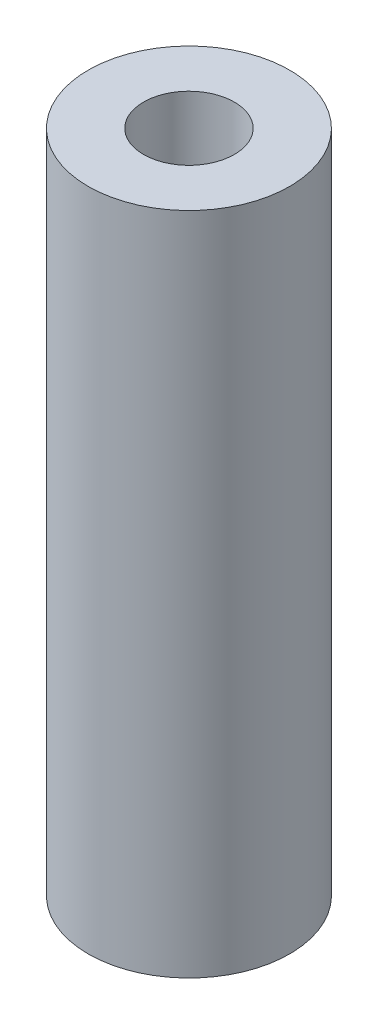
ISO-10303-21;
HEADER;
FILE_DESCRIPTION(('STEP AP214'),'2;1');
FILE_NAME('part.step','',(''),(''),'','','');
FILE_SCHEMA(('AUTOMOTIVE_DESIGN { 1 0 10303 214 1 1 1 1 }'));
ENDSEC;
DATA;
#1=APPLICATION_CONTEXT('core data for automotive mechanical design processes');
#2=APPLICATION_PROTOCOL_DEFINITION('international standard','automotive_design',2000,#1);
#3=PRODUCT_CONTEXT('',#1,'mechanical');
#4=PRODUCT('Part','Part','',(#3));
#5=PRODUCT_RELATED_PRODUCT_CATEGORY('part','',(#4));
#6=PRODUCT_DEFINITION_FORMATION('','',#4);
#7=PRODUCT_DEFINITION_CONTEXT('part definition',#1,'design');
#8=PRODUCT_DEFINITION('design','',#6,#7);
#9=PRODUCT_DEFINITION_SHAPE('','',#8);
#10=(LENGTH_UNIT() NAMED_UNIT(*) SI_UNIT(.MILLI.,.METRE.));
#11=(NAMED_UNIT(*) PLANE_ANGLE_UNIT() SI_UNIT($,.RADIAN.));
#12=(NAMED_UNIT(*) SI_UNIT($,.STERADIAN.) SOLID_ANGLE_UNIT());
#13=UNCERTAINTY_MEASURE_WITH_UNIT(LENGTH_MEASURE(1.E-05),#10,'distance_accuracy_value','');
#14=(GEOMETRIC_REPRESENTATION_CONTEXT(3) GLOBAL_UNCERTAINTY_ASSIGNED_CONTEXT((#13)) GLOBAL_UNIT_ASSIGNED_CONTEXT((#10,
#11,#12)) REPRESENTATION_CONTEXT('',''));
#15=CARTESIAN_POINT('',(0.,0.,0.));
#16=DIRECTION('',(0.,0.,1.));
#17=DIRECTION('',(1.,0.,0.));
#18=AXIS2_PLACEMENT_3D('',#15,#16,#17);
#19=CARTESIAN_POINT('',(0.,19.79,0.));
#20=DIRECTION('',(0.,-1.,0.));
#21=DIRECTION('',(0.,0.,-1.));
#22=AXIS2_PLACEMENT_3D('',#19,#20,#21);
#23=CYLINDRICAL_SURFACE('',#22,3.);
#24=CARTESIAN_POINT('',(0.,19.79,0.));
#25=DIRECTION('',(0.,1.,0.));
#26=DIRECTION('',(0.,0.,1.));
#27=AXIS2_PLACEMENT_3D('',#24,#25,#26);
#28=CIRCLE('',#27,3.);
#29=CARTESIAN_POINT('',(0.,19.79,3.));
#30=VERTEX_POINT('',#29);
#31=EDGE_CURVE('E11',#30,#30,#28,.T.);
#32=ORIENTED_EDGE('',*,*,#31,.F.);
#33=EDGE_LOOP('',(#32));
#34=FACE_BOUND('',#33,.T.);
#35=CARTESIAN_POINT('',(0.,0.,0.));
#36=DIRECTION('',(0.,1.,0.));
#37=DIRECTION('',(0.,0.,1.));
#38=AXIS2_PLACEMENT_3D('',#35,#36,#37);
#39=CIRCLE('',#38,3.);
#40=CARTESIAN_POINT('',(0.,0.,3.));
#41=VERTEX_POINT('',#40);
#42=EDGE_CURVE('E38',#41,#41,#39,.T.);
#43=ORIENTED_EDGE('',*,*,#42,.T.);
#44=EDGE_LOOP('',(#43));
#45=FACE_BOUND('',#44,.T.);
#46=ADVANCED_FACE('F35',(#34,#45),#23,.T.);
#47=CARTESIAN_POINT('',(0.,19.79,0.));
#48=DIRECTION('',(0.,1.,0.));
#49=DIRECTION('',(0.,0.,1.));
#50=AXIS2_PLACEMENT_3D('',#47,#48,#49);
#51=PLANE('',#50);
#52=CARTESIAN_POINT('',(0.,19.79,0.));
#53=DIRECTION('',(0.,1.,0.));
#54=DIRECTION('',(0.,0.,1.));
#55=AXIS2_PLACEMENT_3D('',#52,#53,#54);
#56=CIRCLE('',#55,1.35254999999999);
#57=CARTESIAN_POINT('',(0.,19.79,1.35254999999999));
#58=VERTEX_POINT('',#57);
#59=EDGE_CURVE('E58',#58,#58,#56,.T.);
#60=ORIENTED_EDGE('',*,*,#59,.F.);
#61=EDGE_LOOP('',(#60));
#62=FACE_BOUND('',#61,.T.);
#63=ORIENTED_EDGE('',*,*,#31,.T.);
#64=EDGE_LOOP('',(#63));
#65=FACE_BOUND('',#64,.T.);
#66=ADVANCED_FACE('F77',(#62,#65),#51,.T.);
#67=CARTESIAN_POINT('',(0.,0.,0.));
#68=DIRECTION('',(0.,1.,0.));
#69=DIRECTION('',(0.,0.,1.));
#70=AXIS2_PLACEMENT_3D('',#67,#68,#69);
#71=PLANE('',#70);
#72=CARTESIAN_POINT('',(0.,0.,0.));
#73=DIRECTION('',(0.,-1.,0.));
#74=DIRECTION('',(0.,0.,-1.));
#75=AXIS2_PLACEMENT_3D('',#72,#73,#74);
#76=CIRCLE('',#75,1.35254999999999);
#77=CARTESIAN_POINT('',(0.,0.,-1.35254999999999));
#78=VERTEX_POINT('',#77);
#79=EDGE_CURVE('E59',#78,#78,#76,.T.);
#80=ORIENTED_EDGE('',*,*,#79,.F.);
#81=EDGE_LOOP('',(#80));
#82=FACE_BOUND('',#81,.T.);
#83=ORIENTED_EDGE('',*,*,#42,.F.);
#84=EDGE_LOOP('',(#83));
#85=FACE_BOUND('',#84,.T.);
#86=ADVANCED_FACE('F74',(#82,#85),#71,.F.);
#87=CARTESIAN_POINT('',(0.,12.79,0.));
#88=DIRECTION('',(0.,1.,0.));
#89=DIRECTION('',(0.,0.,1.));
#90=AXIS2_PLACEMENT_3D('',#87,#88,#89);
#91=CONICAL_SURFACE('',#90,1.35255,1.02974425867665);
#92=CARTESIAN_POINT('',(0.,11.9773059697343,0.));
#93=VERTEX_POINT('',#92);
#94=VERTEX_LOOP('',#93);
#95=FACE_BOUND('',#94,.T.);
#96=CARTESIAN_POINT('',(0.,12.79,0.));
#97=DIRECTION('',(0.,1.,0.));
#98=DIRECTION('',(0.,0.,1.));
#99=AXIS2_PLACEMENT_3D('',#96,#97,#98);
#100=CIRCLE('',#99,1.35255);
#101=CARTESIAN_POINT('',(0.,12.79,1.35255));
#102=VERTEX_POINT('',#101);
#103=EDGE_CURVE('E62',#102,#102,#100,.T.);
#104=ORIENTED_EDGE('',*,*,#103,.T.);
#105=EDGE_LOOP('',(#104));
#106=FACE_BOUND('',#105,.T.);
#107=ADVANCED_FACE('F76',(#95,#106),#91,.F.);
#108=CARTESIAN_POINT('',(0.,19.79,0.));
#109=DIRECTION('',(0.,1.,0.));
#110=DIRECTION('',(0.,0.,1.));
#111=AXIS2_PLACEMENT_3D('',#108,#109,#110);
#112=CYLINDRICAL_SURFACE('',#111,1.35254999999999);
#113=ORIENTED_EDGE('',*,*,#103,.F.);
#114=EDGE_LOOP('',(#113));
#115=FACE_BOUND('',#114,.T.);
#116=ORIENTED_EDGE('',*,*,#59,.T.);
#117=EDGE_LOOP('',(#116));
#118=FACE_BOUND('',#117,.T.);
#119=ADVANCED_FACE('F52',(#115,#118),#112,.F.);
#120=CARTESIAN_POINT('',(0.,7.,0.));
#121=DIRECTION('',(0.,-1.,0.));
#122=DIRECTION('',(0.,0.,-1.));
#123=AXIS2_PLACEMENT_3D('',#120,#121,#122);
#124=CONICAL_SURFACE('',#123,1.35255,1.02974425867665);
#125=CARTESIAN_POINT('',(0.,7.81269403026573,0.));
#126=VERTEX_POINT('',#125);
#127=VERTEX_LOOP('',#126);
#128=FACE_BOUND('',#127,.T.);
#129=CARTESIAN_POINT('',(0.,7.,0.));
#130=DIRECTION('',(0.,-1.,0.));
#131=DIRECTION('',(0.,0.,-1.));
#132=AXIS2_PLACEMENT_3D('',#129,#130,#131);
#133=CIRCLE('',#132,1.35255);
#134=CARTESIAN_POINT('',(0.,7.,-1.35255));
#135=VERTEX_POINT('',#134);
#136=EDGE_CURVE('E56',#135,#135,#133,.T.);
#137=ORIENTED_EDGE('',*,*,#136,.T.);
#138=EDGE_LOOP('',(#137));
#139=FACE_BOUND('',#138,.T.);
#140=ADVANCED_FACE('F48',(#128,#139),#124,.F.);
#141=CARTESIAN_POINT('',(0.,0.,0.));
#142=DIRECTION('',(0.,-1.,0.));
#143=DIRECTION('',(0.,0.,-1.));
#144=AXIS2_PLACEMENT_3D('',#141,#142,#143);
#145=CYLINDRICAL_SURFACE('',#144,1.35254999999999);
#146=ORIENTED_EDGE('',*,*,#136,.F.);
#147=EDGE_LOOP('',(#146));
#148=FACE_BOUND('',#147,.T.);
#149=ORIENTED_EDGE('',*,*,#79,.T.);
#150=EDGE_LOOP('',(#149));
#151=FACE_BOUND('',#150,.T.);
#152=ADVANCED_FACE('F51',(#148,#151),#145,.F.);
#153=CLOSED_SHELL('',(#46,#66,#86,#107,#119,#140,#152));
#154=MANIFOLD_SOLID_BREP('B2',#153);
#155=ADVANCED_BREP_SHAPE_REPRESENTATION('',(#18,#154),#14);
#156=SHAPE_DEFINITION_REPRESENTATION(#9,#155);
ENDSEC;
END-ISO-10303-21;
